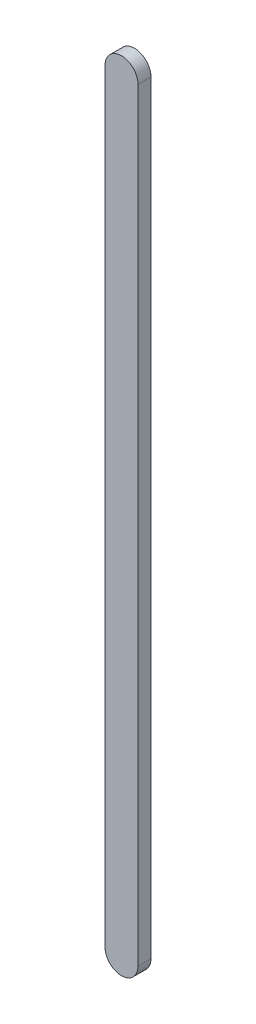
ISO-10303-21;
HEADER;
FILE_DESCRIPTION(('STEP AP214'),'2;1');
FILE_NAME('part.step','',(''),(''),'','','');
FILE_SCHEMA(('AUTOMOTIVE_DESIGN { 1 0 10303 214 1 1 1 1 }'));
ENDSEC;
DATA;
#1=APPLICATION_CONTEXT('core data for automotive mechanical design processes');
#2=APPLICATION_PROTOCOL_DEFINITION('international standard','automotive_design',2000,#1);
#3=PRODUCT_CONTEXT('',#1,'mechanical');
#4=PRODUCT('Part','Part','',(#3));
#5=PRODUCT_RELATED_PRODUCT_CATEGORY('part','',(#4));
#6=PRODUCT_DEFINITION_FORMATION('','',#4);
#7=PRODUCT_DEFINITION_CONTEXT('part definition',#1,'design');
#8=PRODUCT_DEFINITION('design','',#6,#7);
#9=PRODUCT_DEFINITION_SHAPE('','',#8);
#10=(LENGTH_UNIT() NAMED_UNIT(*) SI_UNIT(.MILLI.,.METRE.));
#11=(NAMED_UNIT(*) PLANE_ANGLE_UNIT() SI_UNIT($,.RADIAN.));
#12=(NAMED_UNIT(*) SI_UNIT($,.STERADIAN.) SOLID_ANGLE_UNIT());
#13=UNCERTAINTY_MEASURE_WITH_UNIT(LENGTH_MEASURE(1.E-05),#10,'distance_accuracy_value','');
#14=(GEOMETRIC_REPRESENTATION_CONTEXT(3) GLOBAL_UNCERTAINTY_ASSIGNED_CONTEXT((#13)) GLOBAL_UNIT_ASSIGNED_CONTEXT((#10,
#11,#12)) REPRESENTATION_CONTEXT('',''));
#15=CARTESIAN_POINT('',(0.,0.,0.));
#16=DIRECTION('',(0.,0.,1.));
#17=DIRECTION('',(1.,0.,0.));
#18=AXIS2_PLACEMENT_3D('',#15,#16,#17);
#19=CARTESIAN_POINT('',(137.795,70.27880534,0.));
#20=DIRECTION('',(-1.,0.,0.));
#21=DIRECTION('',(0.,1.,0.));
#22=AXIS2_PLACEMENT_3D('',#19,#20,#21);
#23=PLANE('',#22);
#24=DIRECTION('',(0.,1.,0.));
#25=VECTOR('',#24,1.);
#26=CARTESIAN_POINT('',(137.795,70.27880534,0.1999996));
#27=LINE('',#26,#25);
#28=CARTESIAN_POINT('',(137.795,70.27880534,0.1999996));
#29=VERTEX_POINT('',#28);
#30=CARTESIAN_POINT('',(137.795,82.0390028,0.1999996));
#31=VERTEX_POINT('',#30);
#32=EDGE_CURVE('E11',#29,#31,#27,.T.);
#33=ORIENTED_EDGE('',*,*,#32,.F.);
#34=DIRECTION('',(0.,0.,1.));
#35=VECTOR('',#34,1.);
#36=CARTESIAN_POINT('',(137.795,70.27880534,0.));
#37=LINE('',#36,#35);
#38=CARTESIAN_POINT('',(137.795,70.27880534,0.));
#39=VERTEX_POINT('',#38);
#40=EDGE_CURVE('E24',#39,#29,#37,.T.);
#41=ORIENTED_EDGE('',*,*,#40,.F.);
#42=DIRECTION('',(0.,1.,0.));
#43=VECTOR('',#42,1.);
#44=CARTESIAN_POINT('',(137.795,70.27880534,0.));
#45=LINE('',#44,#43);
#46=CARTESIAN_POINT('',(137.795,82.0390028,0.));
#47=VERTEX_POINT('',#46);
#48=EDGE_CURVE('E75',#39,#47,#45,.T.);
#49=ORIENTED_EDGE('',*,*,#48,.T.);
#50=DIRECTION('',(0.,0.,1.));
#51=VECTOR('',#50,1.);
#52=CARTESIAN_POINT('',(137.795,82.0390028,0.));
#53=LINE('',#52,#51);
#54=EDGE_CURVE('E37',#47,#31,#53,.T.);
#55=ORIENTED_EDGE('',*,*,#54,.T.);
#56=EDGE_LOOP('',(#33,#41,#49,#55));
#57=FACE_BOUND('',#56,.T.);
#58=ADVANCED_FACE('F17',(#57),#23,.F.);
#59=CARTESIAN_POINT('',(137.541,82.0390028,0.));
#60=DIRECTION('',(0.,0.,-1.));
#61=DIRECTION('',(1.,0.,0.));
#62=AXIS2_PLACEMENT_3D('',#59,#60,#61);
#63=CYLINDRICAL_SURFACE('',#62,0.253999999999995);
#64=CARTESIAN_POINT('',(137.541,82.0390028,0.1999996));
#65=DIRECTION('',(0.,0.,1.));
#66=DIRECTION('',(1.,0.,0.));
#67=AXIS2_PLACEMENT_3D('',#64,#65,#66);
#68=CIRCLE('',#67,0.253999999999995);
#69=CARTESIAN_POINT('',(137.287,82.0390028,0.1999996));
#70=VERTEX_POINT('',#69);
#71=EDGE_CURVE('E83',#31,#70,#68,.T.);
#72=ORIENTED_EDGE('',*,*,#71,.F.);
#73=ORIENTED_EDGE('',*,*,#54,.F.);
#74=CARTESIAN_POINT('',(137.541,82.0390028,0.));
#75=DIRECTION('',(0.,0.,1.));
#76=DIRECTION('',(1.,0.,0.));
#77=AXIS2_PLACEMENT_3D('',#74,#75,#76);
#78=CIRCLE('',#77,0.253999999999995);
#79=CARTESIAN_POINT('',(137.287,82.0390028,0.));
#80=VERTEX_POINT('',#79);
#81=EDGE_CURVE('E81',#47,#80,#78,.T.);
#82=ORIENTED_EDGE('',*,*,#81,.T.);
#83=DIRECTION('',(0.,0.,1.));
#84=VECTOR('',#83,1.);
#85=CARTESIAN_POINT('',(137.287,82.0390028,0.));
#86=LINE('',#85,#84);
#87=EDGE_CURVE('E67',#80,#70,#86,.T.);
#88=ORIENTED_EDGE('',*,*,#87,.T.);
#89=EDGE_LOOP('',(#72,#73,#82,#88));
#90=FACE_BOUND('',#89,.T.);
#91=ADVANCED_FACE('F89',(#90),#63,.T.);
#92=CARTESIAN_POINT('',(137.287,82.0390028,0.));
#93=DIRECTION('',(1.,0.,0.));
#94=DIRECTION('',(0.,-1.,0.));
#95=AXIS2_PLACEMENT_3D('',#92,#93,#94);
#96=PLANE('',#95);
#97=DIRECTION('',(0.,-1.,0.));
#98=VECTOR('',#97,1.);
#99=CARTESIAN_POINT('',(137.287,82.0390028,0.1999996));
#100=LINE('',#99,#98);
#101=CARTESIAN_POINT('',(137.287,70.27880534,0.1999996));
#102=VERTEX_POINT('',#101);
#103=EDGE_CURVE('E71',#70,#102,#100,.T.);
#104=ORIENTED_EDGE('',*,*,#103,.F.);
#105=ORIENTED_EDGE('',*,*,#87,.F.);
#106=DIRECTION('',(0.,-1.,0.));
#107=VECTOR('',#106,1.);
#108=CARTESIAN_POINT('',(137.287,82.0390028,0.));
#109=LINE('',#108,#107);
#110=CARTESIAN_POINT('',(137.287,70.27880534,0.));
#111=VERTEX_POINT('',#110);
#112=EDGE_CURVE('E63',#80,#111,#109,.T.);
#113=ORIENTED_EDGE('',*,*,#112,.T.);
#114=DIRECTION('',(0.,0.,1.));
#115=VECTOR('',#114,1.);
#116=CARTESIAN_POINT('',(137.287,70.27880534,0.));
#117=LINE('',#116,#115);
#118=EDGE_CURVE('E53',#111,#102,#117,.T.);
#119=ORIENTED_EDGE('',*,*,#118,.T.);
#120=EDGE_LOOP('',(#104,#105,#113,#119));
#121=FACE_BOUND('',#120,.T.);
#122=ADVANCED_FACE('F66',(#121),#96,.F.);
#123=CARTESIAN_POINT('',(137.541,70.27880534,0.));
#124=DIRECTION('',(0.,0.,-1.));
#125=DIRECTION('',(-1.,0.,0.));
#126=AXIS2_PLACEMENT_3D('',#123,#124,#125);
#127=CYLINDRICAL_SURFACE('',#126,0.253999999999995);
#128=CARTESIAN_POINT('',(137.541,70.27880534,0.1999996));
#129=DIRECTION('',(0.,0.,1.));
#130=DIRECTION('',(-1.,0.,0.));
#131=AXIS2_PLACEMENT_3D('',#128,#129,#130);
#132=CIRCLE('',#131,0.253999999999995);
#133=EDGE_CURVE('E59',#102,#29,#132,.T.);
#134=ORIENTED_EDGE('',*,*,#133,.F.);
#135=ORIENTED_EDGE('',*,*,#118,.F.);
#136=CARTESIAN_POINT('',(137.541,70.27880534,0.));
#137=DIRECTION('',(0.,0.,1.));
#138=DIRECTION('',(-1.,0.,0.));
#139=AXIS2_PLACEMENT_3D('',#136,#137,#138);
#140=CIRCLE('',#139,0.253999999999995);
#141=EDGE_CURVE('E57',#111,#39,#140,.T.);
#142=ORIENTED_EDGE('',*,*,#141,.T.);
#143=ORIENTED_EDGE('',*,*,#40,.T.);
#144=EDGE_LOOP('',(#134,#135,#142,#143));
#145=FACE_BOUND('',#144,.T.);
#146=ADVANCED_FACE('F55',(#145),#127,.T.);
#147=CARTESIAN_POINT('',(137.795,70.27880534,0.));
#148=DIRECTION('',(0.,0.,-1.));
#149=DIRECTION('',(-1.,0.,0.));
#150=AXIS2_PLACEMENT_3D('',#147,#148,#149);
#151=PLANE('',#150);
#152=ORIENTED_EDGE('',*,*,#141,.F.);
#153=ORIENTED_EDGE('',*,*,#112,.F.);
#154=ORIENTED_EDGE('',*,*,#81,.F.);
#155=ORIENTED_EDGE('',*,*,#48,.F.);
#156=EDGE_LOOP('',(#152,#153,#154,#155));
#157=FACE_BOUND('',#156,.T.);
#158=ADVANCED_FACE('F74',(#157),#151,.T.);
#159=CARTESIAN_POINT('',(137.795,70.27880534,0.1999996));
#160=DIRECTION('',(0.,0.,-1.));
#161=DIRECTION('',(-1.,0.,0.));
#162=AXIS2_PLACEMENT_3D('',#159,#160,#161);
#163=PLANE('',#162);
#164=ORIENTED_EDGE('',*,*,#32,.T.);
#165=ORIENTED_EDGE('',*,*,#71,.T.);
#166=ORIENTED_EDGE('',*,*,#103,.T.);
#167=ORIENTED_EDGE('',*,*,#133,.T.);
#168=EDGE_LOOP('',(#164,#165,#166,#167));
#169=FACE_BOUND('',#168,.T.);
#170=ADVANCED_FACE('F91',(#169),#163,.F.);
#171=CLOSED_SHELL('',(#58,#91,#122,#146,#158,#170));
#172=MANIFOLD_SOLID_BREP('B1',#171);
#173=ADVANCED_BREP_SHAPE_REPRESENTATION('',(#18,#172),#14);
#174=SHAPE_DEFINITION_REPRESENTATION(#9,#173);
ENDSEC;
END-ISO-10303-21;
